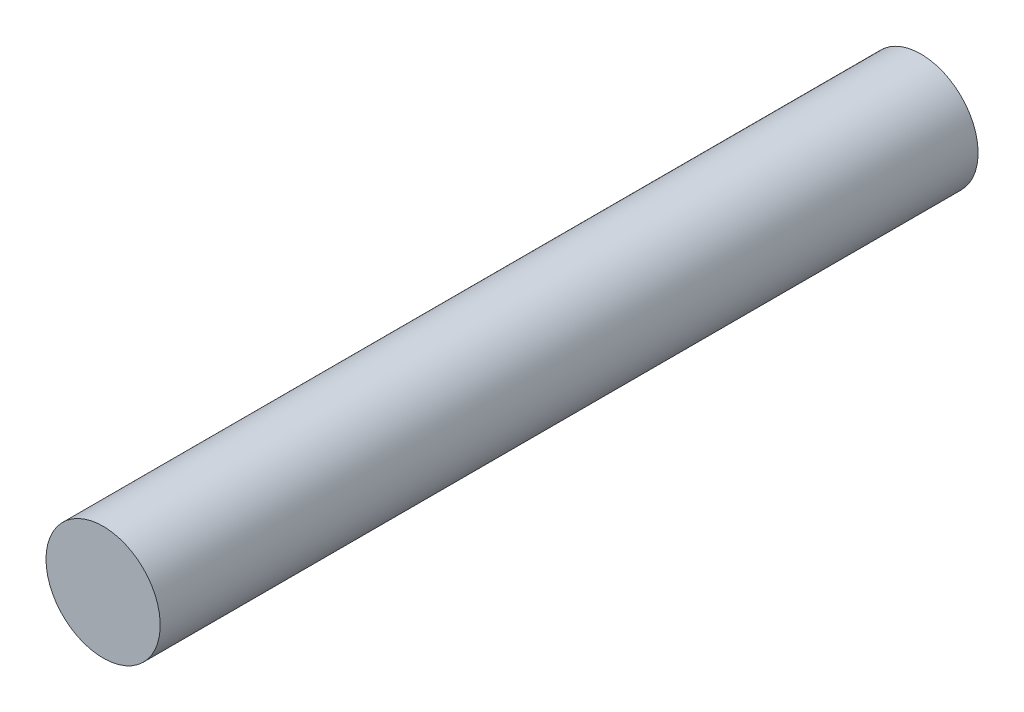
ISO-10303-21;
HEADER;
FILE_DESCRIPTION(('STEP AP214'),'2;1');
FILE_NAME('part.step','',(''),(''),'','','');
FILE_SCHEMA(('AUTOMOTIVE_DESIGN { 1 0 10303 214 1 1 1 1 }'));
ENDSEC;
DATA;
#1=APPLICATION_CONTEXT('core data for automotive mechanical design processes');
#2=APPLICATION_PROTOCOL_DEFINITION('international standard','automotive_design',2000,#1);
#3=PRODUCT_CONTEXT('',#1,'mechanical');
#4=PRODUCT('Part','Part','',(#3));
#5=PRODUCT_RELATED_PRODUCT_CATEGORY('part','',(#4));
#6=PRODUCT_DEFINITION_FORMATION('','',#4);
#7=PRODUCT_DEFINITION_CONTEXT('part definition',#1,'design');
#8=PRODUCT_DEFINITION('design','',#6,#7);
#9=PRODUCT_DEFINITION_SHAPE('','',#8);
#10=(LENGTH_UNIT() NAMED_UNIT(*) SI_UNIT(.MILLI.,.METRE.));
#11=(NAMED_UNIT(*) PLANE_ANGLE_UNIT() SI_UNIT($,.RADIAN.));
#12=(NAMED_UNIT(*) SI_UNIT($,.STERADIAN.) SOLID_ANGLE_UNIT());
#13=UNCERTAINTY_MEASURE_WITH_UNIT(LENGTH_MEASURE(1.E-05),#10,'distance_accuracy_value','');
#14=(GEOMETRIC_REPRESENTATION_CONTEXT(3) GLOBAL_UNCERTAINTY_ASSIGNED_CONTEXT((#13)) GLOBAL_UNIT_ASSIGNED_CONTEXT((#10,
#11,#12)) REPRESENTATION_CONTEXT('',''));
#15=CARTESIAN_POINT('',(0.,0.,0.));
#16=DIRECTION('',(0.,0.,1.));
#17=DIRECTION('',(1.,0.,0.));
#18=AXIS2_PLACEMENT_3D('',#15,#16,#17);
#19=CARTESIAN_POINT('',(0.,0.,-35.8));
#20=DIRECTION('',(0.,0.,1.));
#21=DIRECTION('',(-1.,0.,0.));
#22=AXIS2_PLACEMENT_3D('',#19,#20,#21);
#23=CYLINDRICAL_SURFACE('',#22,2.5);
#24=CARTESIAN_POINT('',(0.,0.,-35.8));
#25=DIRECTION('',(0.,0.,1.));
#26=DIRECTION('',(1.,0.,0.));
#27=AXIS2_PLACEMENT_3D('',#24,#25,#26);
#28=CIRCLE('',#27,2.5);
#29=CARTESIAN_POINT('',(-2.5,0.,-35.8));
#30=VERTEX_POINT('',#29);
#31=EDGE_CURVE('E10',#30,#30,#28,.T.);
#32=CARTESIAN_POINT('',(0.,0.,0.));
#33=DIRECTION('',(0.,0.,1.));
#34=DIRECTION('',(1.,0.,0.));
#35=AXIS2_PLACEMENT_3D('',#32,#33,#34);
#36=CIRCLE('',#35,2.5);
#37=CARTESIAN_POINT('',(-2.5,0.,0.));
#38=VERTEX_POINT('',#37);
#39=EDGE_CURVE('E40',#38,#38,#36,.T.);
#40=CARTESIAN_POINT('',(-2.5,0.,-35.8));
#41=CARTESIAN_POINT('',(-2.5,0.,-35.4270833333333));
#42=CARTESIAN_POINT('',(-2.5,0.,-35.0541666666667));
#43=CARTESIAN_POINT('',(-2.5,0.,-34.3083333333333));
#44=CARTESIAN_POINT('',(-2.5,0.,-33.9354166666667));
#45=CARTESIAN_POINT('',(-2.5,0.,-33.1895833333333));
#46=CARTESIAN_POINT('',(-2.5,0.,-32.8166666666667));
#47=CARTESIAN_POINT('',(-2.5,0.,-32.0708333333333));
#48=CARTESIAN_POINT('',(-2.5,0.,-31.6979166666667));
#49=CARTESIAN_POINT('',(-2.5,0.,-30.9520833333333));
#50=CARTESIAN_POINT('',(-2.5,0.,-30.5791666666667));
#51=CARTESIAN_POINT('',(-2.5,0.,-29.8333333333333));
#52=CARTESIAN_POINT('',(-2.5,0.,-29.4604166666667));
#53=CARTESIAN_POINT('',(-2.5,0.,-28.7145833333333));
#54=CARTESIAN_POINT('',(-2.5,0.,-28.3416666666667));
#55=CARTESIAN_POINT('',(-2.5,0.,-27.5958333333333));
#56=CARTESIAN_POINT('',(-2.5,0.,-27.2229166666667));
#57=CARTESIAN_POINT('',(-2.5,0.,-26.4770833333333));
#58=CARTESIAN_POINT('',(-2.5,0.,-26.1041666666667));
#59=CARTESIAN_POINT('',(-2.5,0.,-25.3583333333333));
#60=CARTESIAN_POINT('',(-2.5,0.,-24.9854166666667));
#61=CARTESIAN_POINT('',(-2.5,0.,-24.2395833333333));
#62=CARTESIAN_POINT('',(-2.5,0.,-23.8666666666667));
#63=CARTESIAN_POINT('',(-2.5,0.,-23.1208333333333));
#64=CARTESIAN_POINT('',(-2.5,0.,-22.7479166666667));
#65=CARTESIAN_POINT('',(-2.5,0.,-22.0020833333333));
#66=CARTESIAN_POINT('',(-2.5,0.,-21.6291666666667));
#67=CARTESIAN_POINT('',(-2.5,0.,-20.8833333333333));
#68=CARTESIAN_POINT('',(-2.5,0.,-20.5104166666667));
#69=CARTESIAN_POINT('',(-2.5,0.,-19.7645833333333));
#70=CARTESIAN_POINT('',(-2.5,0.,-19.3916666666667));
#71=CARTESIAN_POINT('',(-2.5,0.,-18.6458333333333));
#72=CARTESIAN_POINT('',(-2.5,0.,-18.2729166666667));
#73=CARTESIAN_POINT('',(-2.5,0.,-17.5270833333333));
#74=CARTESIAN_POINT('',(-2.5,0.,-17.1541666666667));
#75=CARTESIAN_POINT('',(-2.5,0.,-16.4083333333333));
#76=CARTESIAN_POINT('',(-2.5,0.,-16.0354166666667));
#77=CARTESIAN_POINT('',(-2.5,0.,-15.2895833333333));
#78=CARTESIAN_POINT('',(-2.5,0.,-14.9166666666667));
#79=CARTESIAN_POINT('',(-2.5,0.,-14.1708333333333));
#80=CARTESIAN_POINT('',(-2.5,0.,-13.7979166666667));
#81=CARTESIAN_POINT('',(-2.5,0.,-13.0520833333333));
#82=CARTESIAN_POINT('',(-2.5,0.,-12.6791666666667));
#83=CARTESIAN_POINT('',(-2.5,0.,-11.9333333333333));
#84=CARTESIAN_POINT('',(-2.5,0.,-11.5604166666667));
#85=CARTESIAN_POINT('',(-2.5,0.,-10.8145833333333));
#86=CARTESIAN_POINT('',(-2.5,0.,-10.4416666666667));
#87=CARTESIAN_POINT('',(-2.5,0.,-9.69583333333333));
#88=CARTESIAN_POINT('',(-2.5,0.,-9.32291666666667));
#89=CARTESIAN_POINT('',(-2.5,0.,-8.57708333333333));
#90=CARTESIAN_POINT('',(-2.5,0.,-8.20416666666667));
#91=CARTESIAN_POINT('',(-2.5,0.,-7.45833333333333));
#92=CARTESIAN_POINT('',(-2.5,0.,-7.08541666666667));
#93=CARTESIAN_POINT('',(-2.5,0.,-6.33958333333333));
#94=CARTESIAN_POINT('',(-2.5,0.,-5.96666666666667));
#95=CARTESIAN_POINT('',(-2.5,0.,-5.22083333333334));
#96=CARTESIAN_POINT('',(-2.5,0.,-4.84791666666667));
#97=CARTESIAN_POINT('',(-2.5,0.,-4.10208333333334));
#98=CARTESIAN_POINT('',(-2.5,0.,-3.72916666666667));
#99=CARTESIAN_POINT('',(-2.5,0.,-2.98333333333334));
#100=CARTESIAN_POINT('',(-2.5,0.,-2.61041666666668));
#101=CARTESIAN_POINT('',(-2.5,0.,-1.86458333333334));
#102=CARTESIAN_POINT('',(-2.5,0.,-1.49166666666668));
#103=CARTESIAN_POINT('',(-2.5,0.,-0.745833333333341));
#104=CARTESIAN_POINT('',(-2.5,0.,-0.372916666666674));
#105=CARTESIAN_POINT('',(-2.5,0.,0.));
#106=B_SPLINE_CURVE_WITH_KNOTS('',3,(#40,#41,#42,#43,#44,#45,#46,#47,#48,#49,#50,#51,#52,#53,
#54,#55,#56,#57,#58,#59,#60,#61,#62,#63,#64,#65,#66,#67,#68,#69,#70,#71,#72,#73,#74,#75,#76,#77,
#78,#79,#80,#81,#82,#83,#84,#85,#86,#87,#88,#89,#90,#91,#92,#93,#94,#95,#96,#97,#98,#99,#100,
#101,#102,#103,#104,#105),.UNSPECIFIED.,.F.,.F.,(4,2,2,2,2,2,2,2,2,2,2,2,2,2,2,2,2,2,2,2,2,2,2,
2,2,2,2,2,2,2,2,2,4),(0.,1.11875,2.2375,3.35625000000001,4.475,5.59375,6.7125,7.83125000000001,
8.95,10.06875,11.1875,12.30625,13.425,14.54375,15.6625,16.78125,17.9,19.01875,20.1375,21.25625,
22.375,23.49375,24.6125,25.73125,26.85,27.96875,29.0875,30.20625,31.325,32.44375,33.5625,
34.68125,35.8),.UNSPECIFIED.);
#107=EDGE_CURVE('BSEAM37',#30,#38,#106,.T.);
#108=ORIENTED_EDGE('',*,*,#31,.T.);
#109=ORIENTED_EDGE('',*,*,#39,.F.);
#110=ORIENTED_EDGE('',*,*,#107,.T.);
#111=ORIENTED_EDGE('',*,*,#107,.F.);
#112=EDGE_LOOP('',(#108,#110,#109,#111));
#113=FACE_BOUND('',#112,.T.);
#114=ADVANCED_FACE('F37',(#113),#23,.T.);
#115=CARTESIAN_POINT('',(0.,0.,-35.8));
#116=DIRECTION('',(0.,0.,-1.));
#117=DIRECTION('',(1.,0.,0.));
#118=AXIS2_PLACEMENT_3D('',#115,#116,#117);
#119=PLANE('',#118);
#120=ORIENTED_EDGE('',*,*,#31,.F.);
#121=EDGE_LOOP('',(#120));
#122=FACE_BOUND('',#121,.T.);
#123=ADVANCED_FACE('F52',(#122),#119,.T.);
#124=CARTESIAN_POINT('',(0.,0.,0.));
#125=DIRECTION('',(0.,0.,-1.));
#126=DIRECTION('',(1.,0.,0.));
#127=AXIS2_PLACEMENT_3D('',#124,#125,#126);
#128=PLANE('',#127);
#129=ORIENTED_EDGE('',*,*,#39,.T.);
#130=EDGE_LOOP('',(#129));
#131=FACE_BOUND('',#130,.T.);
#132=ADVANCED_FACE('F49',(#131),#128,.F.);
#133=CLOSED_SHELL('',(#114,#123,#132));
#134=MANIFOLD_SOLID_BREP('B2',#133);
#135=ADVANCED_BREP_SHAPE_REPRESENTATION('',(#18,#134),#14);
#136=SHAPE_DEFINITION_REPRESENTATION(#9,#135);
ENDSEC;
END-ISO-10303-21;
